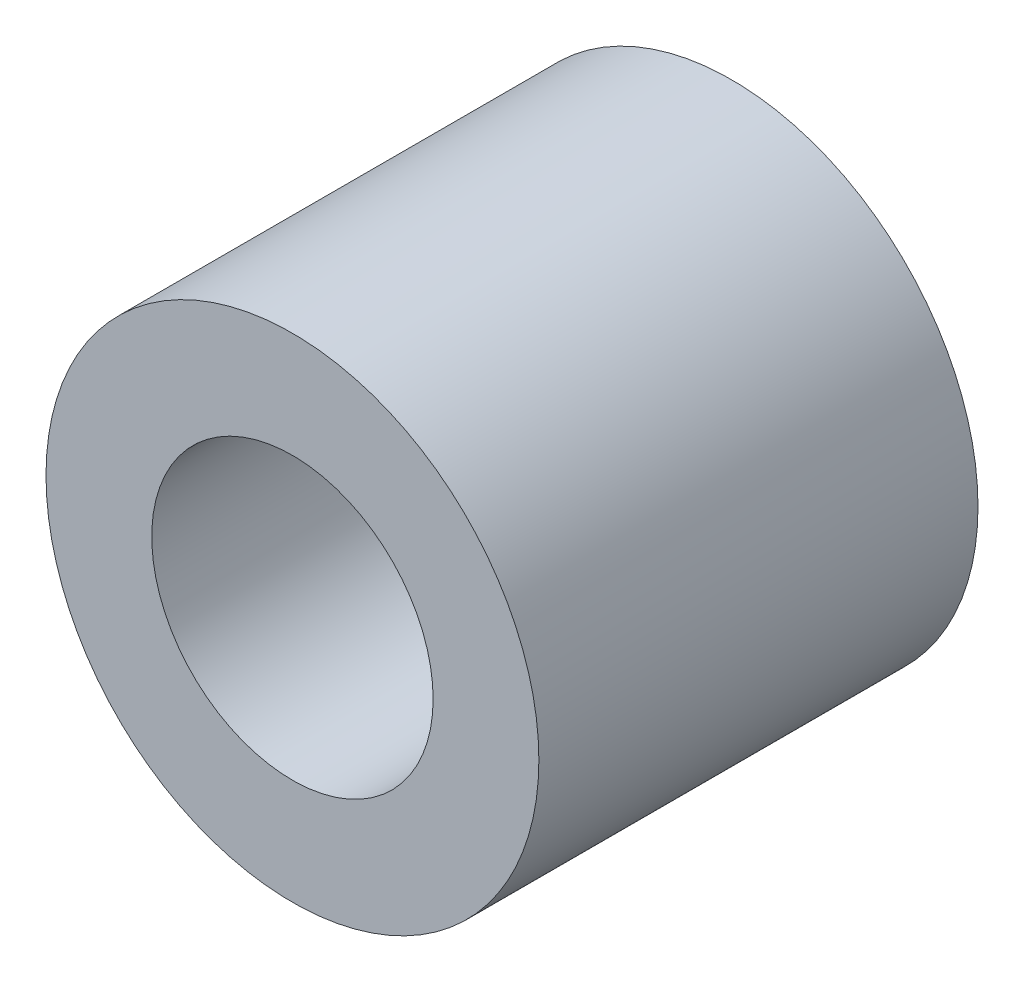
ISO-10303-21;
HEADER;
FILE_DESCRIPTION(('STEP AP214'),'2;1');
FILE_NAME('part.step','',(''),(''),'','','');
FILE_SCHEMA(('AUTOMOTIVE_DESIGN { 1 0 10303 214 1 1 1 1 }'));
ENDSEC;
DATA;
#1=APPLICATION_CONTEXT('core data for automotive mechanical design processes');
#2=APPLICATION_PROTOCOL_DEFINITION('international standard','automotive_design',2000,#1);
#3=PRODUCT_CONTEXT('',#1,'mechanical');
#4=PRODUCT('Part','Part','',(#3));
#5=PRODUCT_RELATED_PRODUCT_CATEGORY('part','',(#4));
#6=PRODUCT_DEFINITION_FORMATION('','',#4);
#7=PRODUCT_DEFINITION_CONTEXT('part definition',#1,'design');
#8=PRODUCT_DEFINITION('design','',#6,#7);
#9=PRODUCT_DEFINITION_SHAPE('','',#8);
#10=(LENGTH_UNIT() NAMED_UNIT(*) SI_UNIT(.MILLI.,.METRE.));
#11=(NAMED_UNIT(*) PLANE_ANGLE_UNIT() SI_UNIT($,.RADIAN.));
#12=(NAMED_UNIT(*) SI_UNIT($,.STERADIAN.) SOLID_ANGLE_UNIT());
#13=UNCERTAINTY_MEASURE_WITH_UNIT(LENGTH_MEASURE(1.E-05),#10,'distance_accuracy_value','');
#14=(GEOMETRIC_REPRESENTATION_CONTEXT(3) GLOBAL_UNCERTAINTY_ASSIGNED_CONTEXT((#13)) GLOBAL_UNIT_ASSIGNED_CONTEXT((#10,
#11,#12)) REPRESENTATION_CONTEXT('',''));
#15=CARTESIAN_POINT('',(0.,0.,0.));
#16=DIRECTION('',(0.,0.,1.));
#17=DIRECTION('',(1.,0.,0.));
#18=AXIS2_PLACEMENT_3D('',#15,#16,#17);
#19=CARTESIAN_POINT('',(0.,0.,6.25));
#20=DIRECTION('',(0.,0.,1.));
#21=DIRECTION('',(1.,0.,0.));
#22=AXIS2_PLACEMENT_3D('',#19,#20,#21);
#23=PLANE('',#22);
#24=CARTESIAN_POINT('',(0.,0.,6.25));
#25=DIRECTION('',(0.,0.,1.));
#26=DIRECTION('',(1.,0.,0.));
#27=AXIS2_PLACEMENT_3D('',#24,#25,#26);
#28=CIRCLE('',#27,7.015);
#29=CARTESIAN_POINT('',(7.015,0.,6.25));
#30=VERTEX_POINT('',#29);
#31=EDGE_CURVE('E10',#30,#30,#28,.T.);
#32=ORIENTED_EDGE('',*,*,#31,.T.);
#33=EDGE_LOOP('',(#32));
#34=FACE_BOUND('',#33,.T.);
#35=CARTESIAN_POINT('',(0.,0.,6.25));
#36=DIRECTION('',(0.,0.,1.));
#37=DIRECTION('',(1.,0.,0.));
#38=AXIS2_PLACEMENT_3D('',#35,#36,#37);
#39=CIRCLE('',#38,4.005);
#40=CARTESIAN_POINT('',(4.005,0.,6.25));
#41=VERTEX_POINT('',#40);
#42=EDGE_CURVE('E42',#41,#41,#39,.T.);
#43=ORIENTED_EDGE('',*,*,#42,.F.);
#44=EDGE_LOOP('',(#43));
#45=FACE_BOUND('',#44,.T.);
#46=ADVANCED_FACE('F31',(#34,#45),#23,.T.);
#47=CARTESIAN_POINT('',(0.,0.,-6.25));
#48=DIRECTION('',(0.,0.,1.));
#49=DIRECTION('',(1.,0.,0.));
#50=AXIS2_PLACEMENT_3D('',#47,#48,#49);
#51=PLANE('',#50);
#52=CARTESIAN_POINT('',(0.,0.,-6.25));
#53=DIRECTION('',(0.,0.,1.));
#54=DIRECTION('',(1.,0.,0.));
#55=AXIS2_PLACEMENT_3D('',#52,#53,#54);
#56=CIRCLE('',#55,7.015);
#57=CARTESIAN_POINT('',(7.015,0.,-6.25));
#58=VERTEX_POINT('',#57);
#59=EDGE_CURVE('E35',#58,#58,#56,.T.);
#60=ORIENTED_EDGE('',*,*,#59,.F.);
#61=EDGE_LOOP('',(#60));
#62=FACE_BOUND('',#61,.T.);
#63=CARTESIAN_POINT('',(0.,0.,-6.25));
#64=DIRECTION('',(0.,0.,1.));
#65=DIRECTION('',(1.,0.,0.));
#66=AXIS2_PLACEMENT_3D('',#63,#64,#65);
#67=CIRCLE('',#66,4.005);
#68=CARTESIAN_POINT('',(4.005,0.,-6.25));
#69=VERTEX_POINT('',#68);
#70=EDGE_CURVE('E44',#69,#69,#67,.T.);
#71=ORIENTED_EDGE('',*,*,#70,.T.);
#72=EDGE_LOOP('',(#71));
#73=FACE_BOUND('',#72,.T.);
#74=ADVANCED_FACE('F54',(#62,#73),#51,.F.);
#75=CARTESIAN_POINT('',(0.,0.,6.25));
#76=DIRECTION('',(0.,0.,-1.));
#77=DIRECTION('',(-1.,0.,0.));
#78=AXIS2_PLACEMENT_3D('',#75,#76,#77);
#79=CYLINDRICAL_SURFACE('',#78,7.015);
#80=ORIENTED_EDGE('',*,*,#31,.F.);
#81=EDGE_LOOP('',(#80));
#82=FACE_BOUND('',#81,.T.);
#83=ORIENTED_EDGE('',*,*,#59,.T.);
#84=EDGE_LOOP('',(#83));
#85=FACE_BOUND('',#84,.T.);
#86=ADVANCED_FACE('F33',(#82,#85),#79,.T.);
#87=CARTESIAN_POINT('',(0.,0.,6.25));
#88=DIRECTION('',(0.,0.,-1.));
#89=DIRECTION('',(-1.,0.,0.));
#90=AXIS2_PLACEMENT_3D('',#87,#88,#89);
#91=CYLINDRICAL_SURFACE('',#90,4.005);
#92=ORIENTED_EDGE('',*,*,#42,.T.);
#93=EDGE_LOOP('',(#92));
#94=FACE_BOUND('',#93,.T.);
#95=ORIENTED_EDGE('',*,*,#70,.F.);
#96=EDGE_LOOP('',(#95));
#97=FACE_BOUND('',#96,.T.);
#98=ADVANCED_FACE('F50',(#94,#97),#91,.F.);
#99=CLOSED_SHELL('',(#46,#74,#86,#98));
#100=MANIFOLD_SOLID_BREP('B2',#99);
#101=ADVANCED_BREP_SHAPE_REPRESENTATION('',(#18,#100),#14);
#102=SHAPE_DEFINITION_REPRESENTATION(#9,#101);
ENDSEC;
END-ISO-10303-21;
